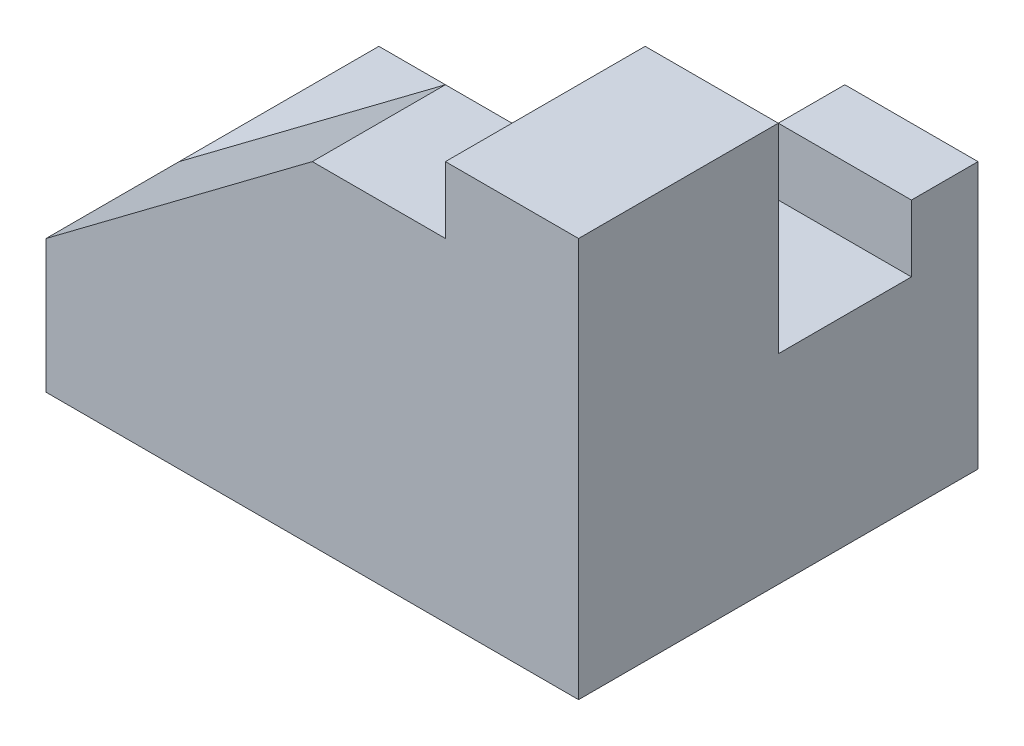
ISO-10303-21;
HEADER;
FILE_DESCRIPTION(('STEP AP214'),'2;1');
FILE_NAME('part.step','',(''),(''),'','','');
FILE_SCHEMA(('AUTOMOTIVE_DESIGN { 1 0 10303 214 1 1 1 1 }'));
ENDSEC;
DATA;
#1=APPLICATION_CONTEXT('core data for automotive mechanical design processes');
#2=APPLICATION_PROTOCOL_DEFINITION('international standard','automotive_design',2000,#1);
#3=PRODUCT_CONTEXT('',#1,'mechanical');
#4=PRODUCT('Part','Part','',(#3));
#5=PRODUCT_RELATED_PRODUCT_CATEGORY('part','',(#4));
#6=PRODUCT_DEFINITION_FORMATION('','',#4);
#7=PRODUCT_DEFINITION_CONTEXT('part definition',#1,'design');
#8=PRODUCT_DEFINITION('design','',#6,#7);
#9=PRODUCT_DEFINITION_SHAPE('','',#8);
#10=(LENGTH_UNIT() NAMED_UNIT(*) SI_UNIT(.MILLI.,.METRE.));
#11=(NAMED_UNIT(*) PLANE_ANGLE_UNIT() SI_UNIT($,.RADIAN.));
#12=(NAMED_UNIT(*) SI_UNIT($,.STERADIAN.) SOLID_ANGLE_UNIT());
#13=UNCERTAINTY_MEASURE_WITH_UNIT(LENGTH_MEASURE(1.E-05),#10,'distance_accuracy_value','');
#14=(GEOMETRIC_REPRESENTATION_CONTEXT(3) GLOBAL_UNCERTAINTY_ASSIGNED_CONTEXT((#13)) GLOBAL_UNIT_ASSIGNED_CONTEXT((#10,
#11,#12)) REPRESENTATION_CONTEXT('',''));
#15=CARTESIAN_POINT('',(0.,0.,0.));
#16=DIRECTION('',(0.,0.,1.));
#17=DIRECTION('',(1.,0.,0.));
#18=AXIS2_PLACEMENT_3D('',#15,#16,#17);
#19=CARTESIAN_POINT('',(0.,0.,0.));
#20=DIRECTION('',(-1.,0.,0.));
#21=DIRECTION('',(0.,0.,1.));
#22=AXIS2_PLACEMENT_3D('',#19,#20,#21);
#23=PLANE('',#22);
#24=DIRECTION('',(0.,0.,-1.));
#25=VECTOR('',#24,1.);
#26=CARTESIAN_POINT('',(0.,-100.,-300.));
#27=LINE('',#26,#25);
#28=CARTESIAN_POINT('',(0.,-100.,100.));
#29=VERTEX_POINT('',#28);
#30=CARTESIAN_POINT('',(0.,-100.,-200.));
#31=VERTEX_POINT('',#30);
#32=EDGE_CURVE('E182',#29,#31,#27,.T.);
#33=ORIENTED_EDGE('',*,*,#32,.F.);
#34=DIRECTION('',(0.,-1.,0.));
#35=VECTOR('',#34,1.);
#36=CARTESIAN_POINT('',(0.,200.,100.));
#37=LINE('',#36,#35);
#38=CARTESIAN_POINT('',(0.,200.,100.));
#39=VERTEX_POINT('',#38);
#40=EDGE_CURVE('E250',#39,#29,#37,.T.);
#41=ORIENTED_EDGE('',*,*,#40,.F.);
#42=DIRECTION('',(0.,0.,-1.));
#43=VECTOR('',#42,1.);
#44=CARTESIAN_POINT('',(0.,200.,300.));
#45=LINE('',#44,#43);
#46=CARTESIAN_POINT('',(0.,200.,300.));
#47=VERTEX_POINT('',#46);
#48=EDGE_CURVE('E249',#47,#39,#45,.T.);
#49=ORIENTED_EDGE('',*,*,#48,.F.);
#50=DIRECTION('',(0.,1.,0.));
#51=VECTOR('',#50,1.);
#52=CARTESIAN_POINT('',(0.,-300.,300.));
#53=LINE('',#52,#51);
#54=CARTESIAN_POINT('',(0.,300.,300.));
#55=VERTEX_POINT('',#54);
#56=EDGE_CURVE('E180',#47,#55,#53,.T.);
#57=ORIENTED_EDGE('',*,*,#56,.T.);
#58=DIRECTION('',(0.,0.,-1.));
#59=VECTOR('',#58,1.);
#60=CARTESIAN_POINT('',(0.,300.,300.));
#61=LINE('',#60,#59);
#62=CARTESIAN_POINT('',(0.,300.,0.));
#63=VERTEX_POINT('',#62);
#64=EDGE_CURVE('E211',#55,#63,#61,.T.);
#65=ORIENTED_EDGE('',*,*,#64,.T.);
#66=DIRECTION('',(0.,-1.,0.));
#67=VECTOR('',#66,1.);
#68=CARTESIAN_POINT('',(0.,300.,0.));
#69=LINE('',#68,#67);
#70=CARTESIAN_POINT('',(0.,-1.66533453693773E-13,0.));
#71=VERTEX_POINT('',#70);
#72=EDGE_CURVE('E214',#63,#71,#69,.T.);
#73=ORIENTED_EDGE('',*,*,#72,.T.);
#74=DIRECTION('',(0.,0.,-1.));
#75=VECTOR('',#74,1.);
#76=CARTESIAN_POINT('',(0.,-1.66533453693773E-13,0.));
#77=LINE('',#76,#75);
#78=CARTESIAN_POINT('',(0.,0.,-200.));
#79=VERTEX_POINT('',#78);
#80=EDGE_CURVE('E217',#71,#79,#77,.T.);
#81=ORIENTED_EDGE('',*,*,#80,.T.);
#82=DIRECTION('',(0.,-1.,0.));
#83=VECTOR('',#82,1.);
#84=CARTESIAN_POINT('',(0.,100.,-200.));
#85=LINE('',#84,#83);
#86=CARTESIAN_POINT('',(0.,100.,-200.));
#87=VERTEX_POINT('',#86);
#88=EDGE_CURVE('E220',#87,#79,#85,.T.);
#89=ORIENTED_EDGE('',*,*,#88,.F.);
#90=DIRECTION('',(0.,0.,1.));
#91=VECTOR('',#90,1.);
#92=CARTESIAN_POINT('',(0.,100.,-300.));
#93=LINE('',#92,#91);
#94=CARTESIAN_POINT('',(0.,100.,-300.));
#95=VERTEX_POINT('',#94);
#96=EDGE_CURVE('E223',#95,#87,#93,.T.);
#97=ORIENTED_EDGE('',*,*,#96,.F.);
#98=DIRECTION('',(0.,1.,0.));
#99=VECTOR('',#98,1.);
#100=CARTESIAN_POINT('',(0.,-300.,-300.));
#101=LINE('',#100,#99);
#102=CARTESIAN_POINT('',(0.,-300.,-300.));
#103=VERTEX_POINT('',#102);
#104=EDGE_CURVE('E192',#103,#95,#101,.T.);
#105=ORIENTED_EDGE('',*,*,#104,.F.);
#106=DIRECTION('',(0.,0.,1.));
#107=VECTOR('',#106,1.);
#108=CARTESIAN_POINT('',(0.,-300.,-200.));
#109=LINE('',#108,#107);
#110=CARTESIAN_POINT('',(0.,-300.,-200.));
#111=VERTEX_POINT('',#110);
#112=EDGE_CURVE('E268',#103,#111,#109,.T.);
#113=ORIENTED_EDGE('',*,*,#112,.T.);
#114=DIRECTION('',(0.,1.,0.));
#115=VECTOR('',#114,1.);
#116=CARTESIAN_POINT('',(0.,-300.001,-200.));
#117=LINE('',#116,#115);
#118=EDGE_CURVE('E278',#111,#31,#117,.T.);
#119=ORIENTED_EDGE('',*,*,#118,.T.);
#120=EDGE_LOOP('',(#33,#41,#49,#57,#65,#73,#81,#89,#97,#105,#113,#119));
#121=FACE_BOUND('',#120,.T.);
#122=ADVANCED_FACE('F47',(#121),#23,.T.);
#123=CARTESIAN_POINT('',(-600.,-100.,-300.));
#124=DIRECTION('',(0.,-1.,0.));
#125=DIRECTION('',(0.,0.,-1.));
#126=AXIS2_PLACEMENT_3D('',#123,#124,#125);
#127=PLANE('',#126);
#128=DIRECTION('',(-1.,0.,0.));
#129=VECTOR('',#128,1.);
#130=CARTESIAN_POINT('',(-600.,-100.,100.));
#131=LINE('',#130,#129);
#132=CARTESIAN_POINT('',(-600.,-100.,100.));
#133=VERTEX_POINT('',#132);
#134=EDGE_CURVE('E164',#29,#133,#131,.T.);
#135=ORIENTED_EDGE('',*,*,#134,.F.);
#136=ORIENTED_EDGE('',*,*,#32,.T.);
#137=DIRECTION('',(1.,0.,0.));
#138=VECTOR('',#137,1.);
#139=CARTESIAN_POINT('',(-600.,-100.,-200.));
#140=LINE('',#139,#138);
#141=CARTESIAN_POINT('',(-100.,-100.,-200.));
#142=VERTEX_POINT('',#141);
#143=EDGE_CURVE('E273',#142,#31,#140,.T.);
#144=ORIENTED_EDGE('',*,*,#143,.F.);
#145=CARTESIAN_POINT('',(-300.,-100.,-200.));
#146=DIRECTION('',(0.,1.,0.));
#147=DIRECTION('',(0.,0.,-1.));
#148=AXIS2_PLACEMENT_3D('',#145,#146,#147);
#149=CIRCLE('',#148,200.);
#150=CARTESIAN_POINT('',(-500.,-100.,-200.));
#151=VERTEX_POINT('',#150);
#152=EDGE_CURVE('E263',#151,#142,#149,.T.);
#153=ORIENTED_EDGE('',*,*,#152,.F.);
#154=CARTESIAN_POINT('',(-600.,-100.,-200.));
#155=VERTEX_POINT('',#154);
#156=EDGE_CURVE('E274',#155,#151,#140,.T.);
#157=ORIENTED_EDGE('',*,*,#156,.F.);
#158=DIRECTION('',(0.,0.,-1.));
#159=VECTOR('',#158,1.);
#160=CARTESIAN_POINT('',(-600.,-100.,-300.));
#161=LINE('',#160,#159);
#162=EDGE_CURVE('E178',#133,#155,#161,.T.);
#163=ORIENTED_EDGE('',*,*,#162,.F.);
#164=EDGE_LOOP('',(#135,#136,#144,#153,#157,#163));
#165=FACE_BOUND('',#164,.T.);
#166=ADVANCED_FACE('F324',(#165),#127,.F.);
#167=CARTESIAN_POINT('',(-600.,-300.001,-200.));
#168=DIRECTION('',(0.,0.,1.));
#169=DIRECTION('',(1.,0.,0.));
#170=AXIS2_PLACEMENT_3D('',#167,#168,#169);
#171=PLANE('',#170);
#172=DIRECTION('',(-1.,0.,0.));
#173=VECTOR('',#172,1.);
#174=CARTESIAN_POINT('',(-600.,-300.,-200.));
#175=LINE('',#174,#173);
#176=CARTESIAN_POINT('',(-100.,-300.,-200.));
#177=VERTEX_POINT('',#176);
#178=EDGE_CURVE('E187',#111,#177,#175,.T.);
#179=ORIENTED_EDGE('',*,*,#178,.T.);
#180=DIRECTION('',(0.,1.,0.));
#181=VECTOR('',#180,1.);
#182=CARTESIAN_POINT('',(-100.,-300.001,-200.));
#183=LINE('',#182,#181);
#184=EDGE_CURVE('E265',#177,#142,#183,.T.);
#185=ORIENTED_EDGE('',*,*,#184,.T.);
#186=ORIENTED_EDGE('',*,*,#143,.T.);
#187=ORIENTED_EDGE('',*,*,#118,.F.);
#188=EDGE_LOOP('',(#179,#185,#186,#187));
#189=FACE_BOUND('',#188,.T.);
#190=ADVANCED_FACE('F319',(#189),#171,.F.);
#191=CARTESIAN_POINT('',(200.,-300.,300.));
#192=DIRECTION('',(0.,0.,1.));
#193=DIRECTION('',(1.,0.,0.));
#194=AXIS2_PLACEMENT_3D('',#191,#192,#193);
#195=PLANE('',#194);
#196=DIRECTION('',(-0.8,-0.6,0.));
#197=VECTOR('',#196,1.);
#198=CARTESIAN_POINT('',(-200.,200.,300.));
#199=LINE('',#198,#197);
#200=CARTESIAN_POINT('',(-200.,200.,300.));
#201=VERTEX_POINT('',#200);
#202=CARTESIAN_POINT('',(-600.,-100.,300.));
#203=VERTEX_POINT('',#202);
#204=EDGE_CURVE('E64',#201,#203,#199,.T.);
#205=ORIENTED_EDGE('',*,*,#204,.T.);
#206=DIRECTION('',(0.,1.,0.));
#207=VECTOR('',#206,1.);
#208=CARTESIAN_POINT('',(-600.,-300.,300.));
#209=LINE('',#208,#207);
#210=CARTESIAN_POINT('',(-600.,-300.,300.));
#211=VERTEX_POINT('',#210);
#212=EDGE_CURVE('E170',#211,#203,#209,.T.);
#213=ORIENTED_EDGE('',*,*,#212,.F.);
#214=DIRECTION('',(-1.,0.,0.));
#215=VECTOR('',#214,1.);
#216=CARTESIAN_POINT('',(200.,-300.,300.));
#217=LINE('',#216,#215);
#218=CARTESIAN_POINT('',(200.,-300.,300.));
#219=VERTEX_POINT('',#218);
#220=EDGE_CURVE('E13',#219,#211,#217,.T.);
#221=ORIENTED_EDGE('',*,*,#220,.F.);
#222=DIRECTION('',(0.,1.,0.));
#223=VECTOR('',#222,1.);
#224=CARTESIAN_POINT('',(200.,-300.,300.));
#225=LINE('',#224,#223);
#226=CARTESIAN_POINT('',(200.,300.,300.));
#227=VERTEX_POINT('',#226);
#228=EDGE_CURVE('E188',#219,#227,#225,.T.);
#229=ORIENTED_EDGE('',*,*,#228,.T.);
#230=DIRECTION('',(-1.,0.,0.));
#231=VECTOR('',#230,1.);
#232=CARTESIAN_POINT('',(200.,300.,300.));
#233=LINE('',#232,#231);
#234=EDGE_CURVE('E51',#227,#55,#233,.T.);
#235=ORIENTED_EDGE('',*,*,#234,.T.);
#236=ORIENTED_EDGE('',*,*,#56,.F.);
#237=DIRECTION('',(1.,0.,0.));
#238=VECTOR('',#237,1.);
#239=CARTESIAN_POINT('',(-600.,200.,300.));
#240=LINE('',#239,#238);
#241=EDGE_CURVE('E172',#201,#47,#240,.T.);
#242=ORIENTED_EDGE('',*,*,#241,.F.);
#243=EDGE_LOOP('',(#205,#213,#221,#229,#235,#236,#242));
#244=FACE_BOUND('',#243,.T.);
#245=ADVANCED_FACE('F49',(#244),#195,.T.);
#246=CARTESIAN_POINT('',(200.,-300.,300.));
#247=DIRECTION('',(0.,1.,0.));
#248=DIRECTION('',(0.,0.,1.));
#249=AXIS2_PLACEMENT_3D('',#246,#247,#248);
#250=PLANE('',#249);
#251=CARTESIAN_POINT('',(-500.,-300.,-200.));
#252=VERTEX_POINT('',#251);
#253=CARTESIAN_POINT('',(-600.,-300.,-200.));
#254=VERTEX_POINT('',#253);
#255=EDGE_CURVE('E281',#252,#254,#175,.T.);
#256=ORIENTED_EDGE('',*,*,#255,.F.);
#257=CARTESIAN_POINT('',(-300.,-300.,-200.));
#258=DIRECTION('',(0.,1.,0.));
#259=DIRECTION('',(0.,0.,1.));
#260=AXIS2_PLACEMENT_3D('',#257,#258,#259);
#261=CIRCLE('',#260,200.);
#262=EDGE_CURVE('E72',#177,#252,#261,.F.);
#263=ORIENTED_EDGE('',*,*,#262,.F.);
#264=ORIENTED_EDGE('',*,*,#178,.F.);
#265=ORIENTED_EDGE('',*,*,#112,.F.);
#266=DIRECTION('',(-1.,0.,0.));
#267=VECTOR('',#266,1.);
#268=CARTESIAN_POINT('',(200.,-300.,-300.));
#269=LINE('',#268,#267);
#270=CARTESIAN_POINT('',(200.,-300.,-300.));
#271=VERTEX_POINT('',#270);
#272=EDGE_CURVE('E56',#271,#103,#269,.T.);
#273=ORIENTED_EDGE('',*,*,#272,.F.);
#274=DIRECTION('',(0.,0.,-1.));
#275=VECTOR('',#274,1.);
#276=CARTESIAN_POINT('',(200.,-300.,300.));
#277=LINE('',#276,#275);
#278=EDGE_CURVE('E207',#219,#271,#277,.T.);
#279=ORIENTED_EDGE('',*,*,#278,.F.);
#280=ORIENTED_EDGE('',*,*,#220,.T.);
#281=DIRECTION('',(0.,0.,1.));
#282=VECTOR('',#281,1.);
#283=CARTESIAN_POINT('',(-600.,-300.,-300.));
#284=LINE('',#283,#282);
#285=EDGE_CURVE('E177',#254,#211,#284,.T.);
#286=ORIENTED_EDGE('',*,*,#285,.F.);
#287=EDGE_LOOP('',(#256,#263,#264,#265,#273,#279,#280,#286));
#288=FACE_BOUND('',#287,.T.);
#289=ADVANCED_FACE('F292',(#288),#250,.F.);
#290=CARTESIAN_POINT('',(200.,-300.,-300.));
#291=DIRECTION('',(0.,0.,1.));
#292=DIRECTION('',(1.,0.,0.));
#293=AXIS2_PLACEMENT_3D('',#290,#291,#292);
#294=PLANE('',#293);
#295=ORIENTED_EDGE('',*,*,#272,.T.);
#296=ORIENTED_EDGE('',*,*,#104,.T.);
#297=DIRECTION('',(-1.,0.,0.));
#298=VECTOR('',#297,1.);
#299=CARTESIAN_POINT('',(200.,100.,-300.));
#300=LINE('',#299,#298);
#301=CARTESIAN_POINT('',(200.,100.,-300.));
#302=VERTEX_POINT('',#301);
#303=EDGE_CURVE('E228',#302,#95,#300,.T.);
#304=ORIENTED_EDGE('',*,*,#303,.F.);
#305=DIRECTION('',(0.,1.,0.));
#306=VECTOR('',#305,1.);
#307=CARTESIAN_POINT('',(200.,0.,-300.));
#308=LINE('',#307,#306);
#309=EDGE_CURVE('E205',#271,#302,#308,.T.);
#310=ORIENTED_EDGE('',*,*,#309,.F.);
#311=EDGE_LOOP('',(#295,#296,#304,#310));
#312=FACE_BOUND('',#311,.T.);
#313=ADVANCED_FACE('F317',(#312),#294,.F.);
#314=CARTESIAN_POINT('',(200.,100.,-300.));
#315=DIRECTION('',(0.,-1.,0.));
#316=DIRECTION('',(0.,0.,-1.));
#317=AXIS2_PLACEMENT_3D('',#314,#315,#316);
#318=PLANE('',#317);
#319=ORIENTED_EDGE('',*,*,#96,.T.);
#320=DIRECTION('',(-1.,0.,0.));
#321=VECTOR('',#320,1.);
#322=CARTESIAN_POINT('',(200.,100.,-200.));
#323=LINE('',#322,#321);
#324=CARTESIAN_POINT('',(200.,100.,-200.));
#325=VERTEX_POINT('',#324);
#326=EDGE_CURVE('E231',#325,#87,#323,.T.);
#327=ORIENTED_EDGE('',*,*,#326,.F.);
#328=DIRECTION('',(0.,0.,1.));
#329=VECTOR('',#328,1.);
#330=CARTESIAN_POINT('',(200.,100.,-300.));
#331=LINE('',#330,#329);
#332=EDGE_CURVE('E203',#302,#325,#331,.T.);
#333=ORIENTED_EDGE('',*,*,#332,.F.);
#334=ORIENTED_EDGE('',*,*,#303,.T.);
#335=EDGE_LOOP('',(#319,#327,#333,#334));
#336=FACE_BOUND('',#335,.T.);
#337=ADVANCED_FACE('F314',(#336),#318,.F.);
#338=CARTESIAN_POINT('',(200.,100.,-200.));
#339=DIRECTION('',(0.,0.,-1.));
#340=DIRECTION('',(-1.,0.,0.));
#341=AXIS2_PLACEMENT_3D('',#338,#339,#340);
#342=PLANE('',#341);
#343=ORIENTED_EDGE('',*,*,#88,.T.);
#344=DIRECTION('',(-1.,0.,0.));
#345=VECTOR('',#344,1.);
#346=CARTESIAN_POINT('',(200.,0.,-200.));
#347=LINE('',#346,#345);
#348=CARTESIAN_POINT('',(200.,0.,-200.));
#349=VERTEX_POINT('',#348);
#350=EDGE_CURVE('E234',#349,#79,#347,.T.);
#351=ORIENTED_EDGE('',*,*,#350,.F.);
#352=DIRECTION('',(0.,-1.,0.));
#353=VECTOR('',#352,1.);
#354=CARTESIAN_POINT('',(200.,100.,-200.));
#355=LINE('',#354,#353);
#356=EDGE_CURVE('E201',#325,#349,#355,.T.);
#357=ORIENTED_EDGE('',*,*,#356,.F.);
#358=ORIENTED_EDGE('',*,*,#326,.T.);
#359=EDGE_LOOP('',(#343,#351,#357,#358));
#360=FACE_BOUND('',#359,.T.);
#361=ADVANCED_FACE('F309',(#360),#342,.F.);
#362=CARTESIAN_POINT('',(200.,-1.66533453693773E-13,0.));
#363=DIRECTION('',(0.,1.,0.));
#364=DIRECTION('',(0.,0.,1.));
#365=AXIS2_PLACEMENT_3D('',#362,#363,#364);
#366=PLANE('',#365);
#367=ORIENTED_EDGE('',*,*,#80,.F.);
#368=DIRECTION('',(-1.,0.,0.));
#369=VECTOR('',#368,1.);
#370=CARTESIAN_POINT('',(200.,-1.66533453693773E-13,0.));
#371=LINE('',#370,#369);
#372=CARTESIAN_POINT('',(200.,-1.66533453693773E-13,0.));
#373=VERTEX_POINT('',#372);
#374=EDGE_CURVE('E236',#373,#71,#371,.T.);
#375=ORIENTED_EDGE('',*,*,#374,.F.);
#376=DIRECTION('',(0.,0.,-1.));
#377=VECTOR('',#376,1.);
#378=CARTESIAN_POINT('',(200.,-1.66533453693773E-13,0.));
#379=LINE('',#378,#377);
#380=EDGE_CURVE('E198',#373,#349,#379,.T.);
#381=ORIENTED_EDGE('',*,*,#380,.T.);
#382=ORIENTED_EDGE('',*,*,#350,.T.);
#383=EDGE_LOOP('',(#367,#375,#381,#382));
#384=FACE_BOUND('',#383,.T.);
#385=ADVANCED_FACE('F304',(#384),#366,.T.);
#386=CARTESIAN_POINT('',(200.,300.,0.));
#387=DIRECTION('',(0.,0.,-1.));
#388=DIRECTION('',(0.,1.,0.));
#389=AXIS2_PLACEMENT_3D('',#386,#387,#388);
#390=PLANE('',#389);
#391=ORIENTED_EDGE('',*,*,#72,.F.);
#392=DIRECTION('',(-1.,0.,0.));
#393=VECTOR('',#392,1.);
#394=CARTESIAN_POINT('',(200.,300.,0.));
#395=LINE('',#394,#393);
#396=CARTESIAN_POINT('',(200.,300.,0.));
#397=VERTEX_POINT('',#396);
#398=EDGE_CURVE('E237',#397,#63,#395,.T.);
#399=ORIENTED_EDGE('',*,*,#398,.F.);
#400=DIRECTION('',(0.,-1.,0.));
#401=VECTOR('',#400,1.);
#402=CARTESIAN_POINT('',(200.,300.,0.));
#403=LINE('',#402,#401);
#404=EDGE_CURVE('E195',#397,#373,#403,.T.);
#405=ORIENTED_EDGE('',*,*,#404,.T.);
#406=ORIENTED_EDGE('',*,*,#374,.T.);
#407=EDGE_LOOP('',(#391,#399,#405,#406));
#408=FACE_BOUND('',#407,.T.);
#409=ADVANCED_FACE('F301',(#408),#390,.T.);
#410=CARTESIAN_POINT('',(200.,300.,300.));
#411=DIRECTION('',(0.,1.,0.));
#412=DIRECTION('',(0.,0.,1.));
#413=AXIS2_PLACEMENT_3D('',#410,#411,#412);
#414=PLANE('',#413);
#415=ORIENTED_EDGE('',*,*,#64,.F.);
#416=ORIENTED_EDGE('',*,*,#234,.F.);
#417=DIRECTION('',(0.,0.,-1.));
#418=VECTOR('',#417,1.);
#419=CARTESIAN_POINT('',(200.,300.,300.));
#420=LINE('',#419,#418);
#421=EDGE_CURVE('E191',#227,#397,#420,.T.);
#422=ORIENTED_EDGE('',*,*,#421,.T.);
#423=ORIENTED_EDGE('',*,*,#398,.T.);
#424=EDGE_LOOP('',(#415,#416,#422,#423));
#425=FACE_BOUND('',#424,.T.);
#426=ADVANCED_FACE('F244',(#425),#414,.T.);
#427=CARTESIAN_POINT('',(200.,0.,0.));
#428=DIRECTION('',(-1.,0.,0.));
#429=DIRECTION('',(0.,0.,1.));
#430=AXIS2_PLACEMENT_3D('',#427,#428,#429);
#431=PLANE('',#430);
#432=ORIENTED_EDGE('',*,*,#228,.F.);
#433=ORIENTED_EDGE('',*,*,#278,.T.);
#434=ORIENTED_EDGE('',*,*,#309,.T.);
#435=ORIENTED_EDGE('',*,*,#332,.T.);
#436=ORIENTED_EDGE('',*,*,#356,.T.);
#437=ORIENTED_EDGE('',*,*,#380,.F.);
#438=ORIENTED_EDGE('',*,*,#404,.F.);
#439=ORIENTED_EDGE('',*,*,#421,.F.);
#440=EDGE_LOOP('',(#432,#433,#434,#435,#436,#437,#438,#439));
#441=FACE_BOUND('',#440,.T.);
#442=ADVANCED_FACE('F297',(#441),#431,.F.);
#443=CARTESIAN_POINT('',(-600.,0.,0.));
#444=DIRECTION('',(1.,0.,0.));
#445=DIRECTION('',(0.,0.,-1.));
#446=AXIS2_PLACEMENT_3D('',#443,#444,#445);
#447=PLANE('',#446);
#448=ORIENTED_EDGE('',*,*,#212,.T.);
#449=DIRECTION('',(0.,0.,-1.));
#450=VECTOR('',#449,1.);
#451=CARTESIAN_POINT('',(-600.,-100.,300.));
#452=LINE('',#451,#450);
#453=EDGE_CURVE('E157',#203,#133,#452,.T.);
#454=ORIENTED_EDGE('',*,*,#453,.T.);
#455=ORIENTED_EDGE('',*,*,#162,.T.);
#456=DIRECTION('',(0.,1.,0.));
#457=VECTOR('',#456,1.);
#458=CARTESIAN_POINT('',(-600.,-300.001,-200.));
#459=LINE('',#458,#457);
#460=EDGE_CURVE('E277',#254,#155,#459,.T.);
#461=ORIENTED_EDGE('',*,*,#460,.F.);
#462=ORIENTED_EDGE('',*,*,#285,.T.);
#463=EDGE_LOOP('',(#448,#454,#455,#461,#462));
#464=FACE_BOUND('',#463,.T.);
#465=ADVANCED_FACE('F174',(#464),#447,.F.);
#466=ORIENTED_EDGE('',*,*,#156,.T.);
#467=DIRECTION('',(0.,1.,0.));
#468=VECTOR('',#467,1.);
#469=CARTESIAN_POINT('',(-500.,-300.001,-200.));
#470=LINE('',#469,#468);
#471=EDGE_CURVE('E266',#252,#151,#470,.T.);
#472=ORIENTED_EDGE('',*,*,#471,.F.);
#473=ORIENTED_EDGE('',*,*,#255,.T.);
#474=ORIENTED_EDGE('',*,*,#460,.T.);
#475=EDGE_LOOP('',(#466,#472,#473,#474));
#476=FACE_BOUND('',#475,.T.);
#477=ADVANCED_FACE('F288',(#476),#171,.F.);
#478=CARTESIAN_POINT('',(-300.,-300.001,-200.));
#479=DIRECTION('',(0.,1.,0.));
#480=DIRECTION('',(0.,0.,1.));
#481=AXIS2_PLACEMENT_3D('',#478,#479,#480);
#482=CYLINDRICAL_SURFACE('',#481,200.);
#483=ORIENTED_EDGE('',*,*,#262,.T.);
#484=ORIENTED_EDGE('',*,*,#471,.T.);
#485=ORIENTED_EDGE('',*,*,#152,.T.);
#486=ORIENTED_EDGE('',*,*,#184,.F.);
#487=EDGE_LOOP('',(#483,#484,#485,#486));
#488=FACE_BOUND('',#487,.T.);
#489=ADVANCED_FACE('F336',(#488),#482,.F.);
#490=CARTESIAN_POINT('',(-600.,200.,100.));
#491=DIRECTION('',(0.,0.,1.));
#492=DIRECTION('',(1.,0.,0.));
#493=AXIS2_PLACEMENT_3D('',#490,#491,#492);
#494=PLANE('',#493);
#495=ORIENTED_EDGE('',*,*,#134,.T.);
#496=DIRECTION('',(-0.8,-0.6,0.));
#497=VECTOR('',#496,1.);
#498=CARTESIAN_POINT('',(-200.,200.,100.));
#499=LINE('',#498,#497);
#500=CARTESIAN_POINT('',(-200.,200.,100.));
#501=VERTEX_POINT('',#500);
#502=EDGE_CURVE('E160',#501,#133,#499,.T.);
#503=ORIENTED_EDGE('',*,*,#502,.F.);
#504=DIRECTION('',(-1.,0.,0.));
#505=VECTOR('',#504,1.);
#506=CARTESIAN_POINT('',(-600.,200.,100.));
#507=LINE('',#506,#505);
#508=EDGE_CURVE('E254',#39,#501,#507,.T.);
#509=ORIENTED_EDGE('',*,*,#508,.F.);
#510=ORIENTED_EDGE('',*,*,#40,.T.);
#511=EDGE_LOOP('',(#495,#503,#509,#510));
#512=FACE_BOUND('',#511,.T.);
#513=ADVANCED_FACE('F326',(#512),#494,.F.);
#514=CARTESIAN_POINT('',(0.,200.,0.));
#515=DIRECTION('',(0.,-1.,0.));
#516=DIRECTION('',(0.,0.,-1.));
#517=AXIS2_PLACEMENT_3D('',#514,#515,#516);
#518=PLANE('',#517);
#519=ORIENTED_EDGE('',*,*,#508,.T.);
#520=DIRECTION('',(0.,0.,-1.));
#521=VECTOR('',#520,1.);
#522=CARTESIAN_POINT('',(-200.,200.,300.));
#523=LINE('',#522,#521);
#524=EDGE_CURVE('E165',#201,#501,#523,.T.);
#525=ORIENTED_EDGE('',*,*,#524,.F.);
#526=ORIENTED_EDGE('',*,*,#241,.T.);
#527=ORIENTED_EDGE('',*,*,#48,.T.);
#528=EDGE_LOOP('',(#519,#525,#526,#527));
#529=FACE_BOUND('',#528,.T.);
#530=ADVANCED_FACE('F327',(#529),#518,.F.);
#531=CARTESIAN_POINT('',(-200.,200.,300.));
#532=DIRECTION('',(0.6,-0.8,0.));
#533=DIRECTION('',(0.8,0.6,0.));
#534=AXIS2_PLACEMENT_3D('',#531,#532,#533);
#535=PLANE('',#534);
#536=ORIENTED_EDGE('',*,*,#502,.T.);
#537=ORIENTED_EDGE('',*,*,#453,.F.);
#538=ORIENTED_EDGE('',*,*,#204,.F.);
#539=ORIENTED_EDGE('',*,*,#524,.T.);
#540=EDGE_LOOP('',(#536,#537,#538,#539));
#541=FACE_BOUND('',#540,.T.);
#542=ADVANCED_FACE('F158',(#541),#535,.F.);
#543=CLOSED_SHELL('',(#122,#166,#190,#245,#289,#313,#337,#361,#385,#409,#426,#442,#465,#477,
#489,#513,#530,#542));
#544=MANIFOLD_SOLID_BREP('B2',#543);
#545=ADVANCED_BREP_SHAPE_REPRESENTATION('',(#18,#544),#14);
#546=SHAPE_DEFINITION_REPRESENTATION(#9,#545);
ENDSEC;
END-ISO-10303-21;
